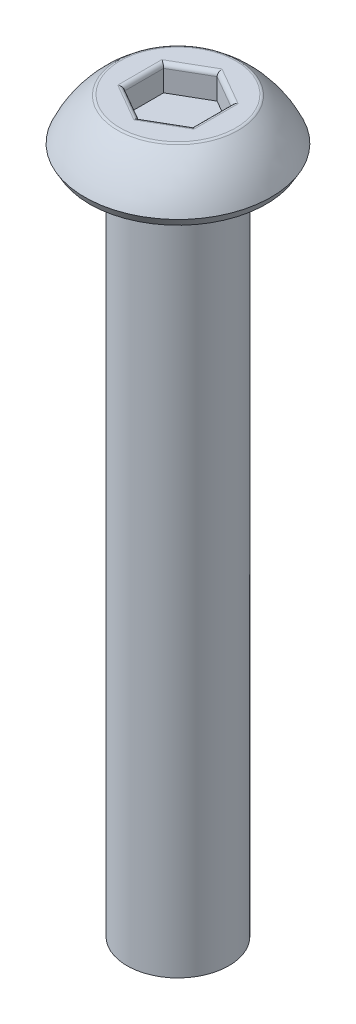
ISO-10303-21;
HEADER;
FILE_DESCRIPTION(('STEP AP214'),'2;1');
FILE_NAME('part.step','',(''),(''),'','','');
FILE_SCHEMA(('AUTOMOTIVE_DESIGN { 1 0 10303 214 1 1 1 1 }'));
ENDSEC;
DATA;
#1=APPLICATION_CONTEXT('core data for automotive mechanical design processes');
#2=APPLICATION_PROTOCOL_DEFINITION('international standard','automotive_design',2000,#1);
#3=PRODUCT_CONTEXT('',#1,'mechanical');
#4=PRODUCT('Part','Part','',(#3));
#5=PRODUCT_RELATED_PRODUCT_CATEGORY('part','',(#4));
#6=PRODUCT_DEFINITION_FORMATION('','',#4);
#7=PRODUCT_DEFINITION_CONTEXT('part definition',#1,'design');
#8=PRODUCT_DEFINITION('design','',#6,#7);
#9=PRODUCT_DEFINITION_SHAPE('','',#8);
#10=(LENGTH_UNIT() NAMED_UNIT(*) SI_UNIT(.MILLI.,.METRE.));
#11=(NAMED_UNIT(*) PLANE_ANGLE_UNIT() SI_UNIT($,.RADIAN.));
#12=(NAMED_UNIT(*) SI_UNIT($,.STERADIAN.) SOLID_ANGLE_UNIT());
#13=UNCERTAINTY_MEASURE_WITH_UNIT(LENGTH_MEASURE(1.E-05),#10,'distance_accuracy_value','');
#14=(GEOMETRIC_REPRESENTATION_CONTEXT(3) GLOBAL_UNCERTAINTY_ASSIGNED_CONTEXT((#13)) GLOBAL_UNIT_ASSIGNED_CONTEXT((#10,
#11,#12)) REPRESENTATION_CONTEXT('',''));
#15=CARTESIAN_POINT('',(0.,0.,0.));
#16=DIRECTION('',(0.,0.,1.));
#17=DIRECTION('',(1.,0.,0.));
#18=AXIS2_PLACEMENT_3D('',#15,#16,#17);
#19=CARTESIAN_POINT('',(0.,1.5,0.));
#20=DIRECTION('',(0.,-1.,0.));
#21=DIRECTION('',(0.,0.,-1.));
#22=AXIS2_PLACEMENT_3D('',#19,#20,#21);
#23=PLANE('',#22);
#24=CARTESIAN_POINT('',(0.,1.5,0.));
#25=DIRECTION('',(0.,-1.,0.));
#26=DIRECTION('',(0.,0.,-1.));
#27=AXIS2_PLACEMENT_3D('',#24,#25,#26);
#28=CIRCLE('',#27,1.70906948191647);
#29=CARTESIAN_POINT('',(0.,1.5,-1.70906948191647));
#30=VERTEX_POINT('',#29);
#31=EDGE_CURVE('E178',#30,#30,#28,.F.);
#32=ORIENTED_EDGE('',*,*,#31,.T.);
#33=EDGE_LOOP('',(#32));
#34=FACE_BOUND('',#33,.T.);
#35=DIRECTION('',(0.866025403784439,0.,-0.5));
#36=VECTOR('',#35,1.);
#37=CARTESIAN_POINT('',(0.5625,1.5,0.974278579257493));
#38=LINE('',#37,#36);
#39=CARTESIAN_POINT('',(1.125,1.5,0.649519052838329));
#40=VERTEX_POINT('',#39);
#41=CARTESIAN_POINT('',(0.,1.5,1.29903810567666));
#42=VERTEX_POINT('',#41);
#43=EDGE_CURVE('E173',#40,#42,#38,.F.);
#44=ORIENTED_EDGE('',*,*,#43,.T.);
#45=DIRECTION('',(0.866025403784439,0.,0.5));
#46=VECTOR('',#45,1.);
#47=CARTESIAN_POINT('',(-0.5625,1.5,0.974278579257493));
#48=LINE('',#47,#46);
#49=CARTESIAN_POINT('',(-1.125,1.5,0.649519052838329));
#50=VERTEX_POINT('',#49);
#51=EDGE_CURVE('E175',#42,#50,#48,.F.);
#52=ORIENTED_EDGE('',*,*,#51,.T.);
#53=DIRECTION('',(0.,0.,1.));
#54=VECTOR('',#53,1.);
#55=CARTESIAN_POINT('',(-1.125,1.5,0.));
#56=LINE('',#55,#54);
#57=CARTESIAN_POINT('',(-1.125,1.5,-0.649519052838329));
#58=VERTEX_POINT('',#57);
#59=EDGE_CURVE('E165',#50,#58,#56,.F.);
#60=ORIENTED_EDGE('',*,*,#59,.T.);
#61=DIRECTION('',(-0.866025403784439,0.,0.5));
#62=VECTOR('',#61,1.);
#63=CARTESIAN_POINT('',(-0.5625,1.5,-0.974278579257493));
#64=LINE('',#63,#62);
#65=CARTESIAN_POINT('',(0.,1.5,-1.29903810567666));
#66=VERTEX_POINT('',#65);
#67=EDGE_CURVE('E167',#58,#66,#64,.F.);
#68=ORIENTED_EDGE('',*,*,#67,.T.);
#69=DIRECTION('',(-0.866025403784439,0.,-0.5));
#70=VECTOR('',#69,1.);
#71=CARTESIAN_POINT('',(0.5625,1.5,-0.974278579257494));
#72=LINE('',#71,#70);
#73=CARTESIAN_POINT('',(1.125,1.5,-0.64951905283833));
#74=VERTEX_POINT('',#73);
#75=EDGE_CURVE('E169',#66,#74,#72,.F.);
#76=ORIENTED_EDGE('',*,*,#75,.T.);
#77=DIRECTION('',(0.,0.,-1.));
#78=VECTOR('',#77,1.);
#79=CARTESIAN_POINT('',(1.125,1.5,0.));
#80=LINE('',#79,#78);
#81=EDGE_CURVE('E171',#74,#40,#80,.F.);
#82=ORIENTED_EDGE('',*,*,#81,.T.);
#83=EDGE_LOOP('',(#44,#52,#60,#68,#76,#82));
#84=FACE_BOUND('',#83,.T.);
#85=ADVANCED_FACE('F36',(#34,#84),#23,.F.);
#86=CARTESIAN_POINT('',(0.,-0.931154789034212,0.));
#87=DIRECTION('',(0.,-1.,0.));
#88=DIRECTION('',(0.,0.,-1.));
#89=AXIS2_PLACEMENT_3D('',#86,#87,#88);
#90=DEGENERATE_TOROIDAL_SURFACE('',#89,0.00769348629276519,3.,.F.);
#91=CARTESIAN_POINT('',(0.,1.47526759952323,0.));
#92=DIRECTION('',(0.,-1.,0.));
#93=DIRECTION('',(0.,0.,-1.));
#94=AXIS2_PLACEMENT_3D('',#91,#92,#93);
#95=CIRCLE('',#94,1.78371135009948);
#96=CARTESIAN_POINT('',(0.,1.47526759952323,-1.78371135009948));
#97=VERTEX_POINT('',#96);
#98=EDGE_CURVE('E162',#97,#97,#95,.T.);
#99=ORIENTED_EDGE('',*,*,#98,.T.);
#100=EDGE_LOOP('',(#99));
#101=FACE_BOUND('',#100,.T.);
#102=CARTESIAN_POINT('',(0.,0.25,0.));
#103=DIRECTION('',(0.,-1.,0.));
#104=DIRECTION('',(0.,0.,-1.));
#105=AXIS2_PLACEMENT_3D('',#102,#103,#104);
#106=CIRCLE('',#105,2.75);
#107=CARTESIAN_POINT('',(0.,0.25,-2.75));
#108=VERTEX_POINT('',#107);
#109=EDGE_CURVE('E159',#108,#108,#106,.T.);
#110=ORIENTED_EDGE('',*,*,#109,.F.);
#111=EDGE_LOOP('',(#110));
#112=FACE_BOUND('',#111,.T.);
#113=ADVANCED_FACE('F245',(#101,#112),#90,.F.);
#114=CARTESIAN_POINT('',(0.,0.25,0.));
#115=DIRECTION('',(0.,1.,0.));
#116=DIRECTION('',(0.,0.,1.));
#117=AXIS2_PLACEMENT_3D('',#114,#115,#116);
#118=CONICAL_SURFACE('',#117,2.75,0.523598775598296);
#119=CARTESIAN_POINT('',(0.,0.,0.));
#120=DIRECTION('',(0.,-1.,0.));
#121=DIRECTION('',(0.,0.,-1.));
#122=AXIS2_PLACEMENT_3D('',#119,#120,#121);
#123=CIRCLE('',#122,2.60566243270259);
#124=CARTESIAN_POINT('',(0.,0.,-2.60566243270259));
#125=VERTEX_POINT('',#124);
#126=EDGE_CURVE('E156',#125,#125,#123,.T.);
#127=ORIENTED_EDGE('',*,*,#126,.F.);
#128=EDGE_LOOP('',(#127));
#129=FACE_BOUND('',#128,.T.);
#130=ORIENTED_EDGE('',*,*,#109,.T.);
#131=EDGE_LOOP('',(#130));
#132=FACE_BOUND('',#131,.T.);
#133=ADVANCED_FACE('F251',(#129,#132),#118,.T.);
#134=CARTESIAN_POINT('',(0.,0.,2.60566243270259));
#135=DIRECTION('',(0.,1.,0.));
#136=DIRECTION('',(0.,0.,1.));
#137=AXIS2_PLACEMENT_3D('',#134,#135,#136);
#138=PLANE('',#137);
#139=CARTESIAN_POINT('',(0.,0.,0.));
#140=DIRECTION('',(0.,-1.,0.));
#141=DIRECTION('',(0.,0.,-1.));
#142=AXIS2_PLACEMENT_3D('',#139,#140,#141);
#143=CIRCLE('',#142,1.5);
#144=CARTESIAN_POINT('',(0.,0.,-1.5));
#145=VERTEX_POINT('',#144);
#146=EDGE_CURVE('E153',#145,#145,#143,.T.);
#147=ORIENTED_EDGE('',*,*,#146,.F.);
#148=EDGE_LOOP('',(#147));
#149=FACE_BOUND('',#148,.T.);
#150=ORIENTED_EDGE('',*,*,#126,.T.);
#151=EDGE_LOOP('',(#150));
#152=FACE_BOUND('',#151,.T.);
#153=ADVANCED_FACE('F270',(#149,#152),#138,.F.);
#154=CARTESIAN_POINT('',(0.,-20.,0.));
#155=DIRECTION('',(0.,-1.,0.));
#156=DIRECTION('',(0.,0.,-1.));
#157=AXIS2_PLACEMENT_3D('',#154,#155,#156);
#158=CYLINDRICAL_SURFACE('',#157,1.5);
#159=CARTESIAN_POINT('',(0.,-20.,0.));
#160=DIRECTION('',(0.,-1.,0.));
#161=DIRECTION('',(0.,0.,-1.));
#162=AXIS2_PLACEMENT_3D('',#159,#160,#161);
#163=CIRCLE('',#162,1.5);
#164=CARTESIAN_POINT('',(0.,-20.,-1.5));
#165=VERTEX_POINT('',#164);
#166=EDGE_CURVE('E140',#165,#165,#163,.T.);
#167=ORIENTED_EDGE('',*,*,#166,.F.);
#168=EDGE_LOOP('',(#167));
#169=FACE_BOUND('',#168,.T.);
#170=ORIENTED_EDGE('',*,*,#146,.T.);
#171=EDGE_LOOP('',(#170));
#172=FACE_BOUND('',#171,.T.);
#173=ADVANCED_FACE('F275',(#169,#172),#158,.T.);
#174=CARTESIAN_POINT('',(0.,-20.,1.5));
#175=DIRECTION('',(0.,1.,0.));
#176=DIRECTION('',(0.,0.,1.));
#177=AXIS2_PLACEMENT_3D('',#174,#175,#176);
#178=PLANE('',#177);
#179=ORIENTED_EDGE('',*,*,#166,.T.);
#180=EDGE_LOOP('',(#179));
#181=FACE_BOUND('',#180,.T.);
#182=ADVANCED_FACE('F282',(#181),#178,.F.);
#183=CARTESIAN_POINT('',(0.999999999999999,0.75,-0.577350269189626));
#184=DIRECTION('',(0.5,0.,-0.866025403784439));
#185=DIRECTION('',(-0.866025403784439,0.,-0.5));
#186=AXIS2_PLACEMENT_3D('',#183,#184,#185);
#187=PLANE('',#186);
#188=DIRECTION('',(0.,1.,0.));
#189=VECTOR('',#188,1.);
#190=CARTESIAN_POINT('',(0.999999999999999,0.75,-0.577350269189626));
#191=LINE('',#190,#189);
#192=CARTESIAN_POINT('',(0.999999999999999,0.75,-0.577350269189626));
#193=VERTEX_POINT('',#192);
#194=CARTESIAN_POINT('',(0.999999999999999,1.375,-0.577350269189626));
#195=VERTEX_POINT('',#194);
#196=EDGE_CURVE('E138',#193,#195,#191,.T.);
#197=ORIENTED_EDGE('',*,*,#196,.T.);
#198=DIRECTION('',(-0.866025403784439,0.,-0.5));
#199=VECTOR('',#198,1.);
#200=CARTESIAN_POINT('',(0.999999999999999,1.375,-0.577350269189626));
#201=LINE('',#200,#199);
#202=CARTESIAN_POINT('',(0.,1.375,-1.15470053837925));
#203=VERTEX_POINT('',#202);
#204=EDGE_CURVE('E60',#195,#203,#201,.T.);
#205=ORIENTED_EDGE('',*,*,#204,.T.);
#206=DIRECTION('',(0.,1.,0.));
#207=VECTOR('',#206,1.);
#208=CARTESIAN_POINT('',(0.,0.75,-1.15470053837925));
#209=LINE('',#208,#207);
#210=CARTESIAN_POINT('',(0.,0.75,-1.15470053837925));
#211=VERTEX_POINT('',#210);
#212=EDGE_CURVE('E106',#211,#203,#209,.T.);
#213=ORIENTED_EDGE('',*,*,#212,.F.);
#214=DIRECTION('',(-0.866025403784439,0.,-0.5));
#215=VECTOR('',#214,1.);
#216=CARTESIAN_POINT('',(0.999999999999999,0.75,-0.577350269189626));
#217=LINE('',#216,#215);
#218=EDGE_CURVE('E110',#193,#211,#217,.T.);
#219=ORIENTED_EDGE('',*,*,#218,.F.);
#220=EDGE_LOOP('',(#197,#205,#213,#219));
#221=FACE_BOUND('',#220,.T.);
#222=ADVANCED_FACE('F108',(#221),#187,.F.);
#223=CARTESIAN_POINT('',(1.,0.75,0.577350269189626));
#224=DIRECTION('',(1.,0.,0.));
#225=DIRECTION('',(0.,0.,-1.));
#226=AXIS2_PLACEMENT_3D('',#223,#224,#225);
#227=PLANE('',#226);
#228=DIRECTION('',(0.,1.,0.));
#229=VECTOR('',#228,1.);
#230=CARTESIAN_POINT('',(1.,0.75,0.577350269189626));
#231=LINE('',#230,#229);
#232=CARTESIAN_POINT('',(1.,0.75,0.577350269189626));
#233=VERTEX_POINT('',#232);
#234=CARTESIAN_POINT('',(1.,1.375,0.577350269189626));
#235=VERTEX_POINT('',#234);
#236=EDGE_CURVE('E141',#233,#235,#231,.T.);
#237=ORIENTED_EDGE('',*,*,#236,.T.);
#238=DIRECTION('',(0.,0.,-1.));
#239=VECTOR('',#238,1.);
#240=CARTESIAN_POINT('',(1.,1.375,0.577350269189626));
#241=LINE('',#240,#239);
#242=EDGE_CURVE('E186',#235,#195,#241,.T.);
#243=ORIENTED_EDGE('',*,*,#242,.T.);
#244=ORIENTED_EDGE('',*,*,#196,.F.);
#245=DIRECTION('',(0.,0.,-1.));
#246=VECTOR('',#245,1.);
#247=CARTESIAN_POINT('',(1.,0.75,0.577350269189626));
#248=LINE('',#247,#246);
#249=EDGE_CURVE('E114',#233,#193,#248,.T.);
#250=ORIENTED_EDGE('',*,*,#249,.F.);
#251=EDGE_LOOP('',(#237,#243,#244,#250));
#252=FACE_BOUND('',#251,.T.);
#253=ADVANCED_FACE('F226',(#252),#227,.F.);
#254=CARTESIAN_POINT('',(0.,0.75,1.15470053837925));
#255=DIRECTION('',(0.5,0.,0.866025403784439));
#256=DIRECTION('',(0.866025403784439,0.,-0.5));
#257=AXIS2_PLACEMENT_3D('',#254,#255,#256);
#258=PLANE('',#257);
#259=DIRECTION('',(0.,1.,0.));
#260=VECTOR('',#259,1.);
#261=CARTESIAN_POINT('',(0.,0.75,1.15470053837925));
#262=LINE('',#261,#260);
#263=CARTESIAN_POINT('',(0.,0.75,1.15470053837925));
#264=VERTEX_POINT('',#263);
#265=CARTESIAN_POINT('',(0.,1.375,1.15470053837925));
#266=VERTEX_POINT('',#265);
#267=EDGE_CURVE('E144',#264,#266,#262,.T.);
#268=ORIENTED_EDGE('',*,*,#267,.T.);
#269=DIRECTION('',(0.866025403784439,0.,-0.5));
#270=VECTOR('',#269,1.);
#271=CARTESIAN_POINT('',(0.,1.375,1.15470053837925));
#272=LINE('',#271,#270);
#273=EDGE_CURVE('E184',#266,#235,#272,.T.);
#274=ORIENTED_EDGE('',*,*,#273,.T.);
#275=ORIENTED_EDGE('',*,*,#236,.F.);
#276=DIRECTION('',(0.866025403784439,0.,-0.5));
#277=VECTOR('',#276,1.);
#278=CARTESIAN_POINT('',(0.,0.75,1.15470053837925));
#279=LINE('',#278,#277);
#280=EDGE_CURVE('E135',#264,#233,#279,.T.);
#281=ORIENTED_EDGE('',*,*,#280,.F.);
#282=EDGE_LOOP('',(#268,#274,#275,#281));
#283=FACE_BOUND('',#282,.T.);
#284=ADVANCED_FACE('F227',(#283),#258,.F.);
#285=CARTESIAN_POINT('',(-0.999999999999999,0.75,0.577350269189626));
#286=DIRECTION('',(-0.5,0.,0.866025403784439));
#287=DIRECTION('',(0.866025403784439,0.,0.5));
#288=AXIS2_PLACEMENT_3D('',#285,#286,#287);
#289=PLANE('',#288);
#290=DIRECTION('',(0.,1.,0.));
#291=VECTOR('',#290,1.);
#292=CARTESIAN_POINT('',(-0.999999999999999,0.75,0.577350269189626));
#293=LINE('',#292,#291);
#294=CARTESIAN_POINT('',(-0.999999999999999,0.75,0.577350269189626));
#295=VERTEX_POINT('',#294);
#296=CARTESIAN_POINT('',(-0.999999999999999,1.375,0.577350269189626));
#297=VERTEX_POINT('',#296);
#298=EDGE_CURVE('E147',#295,#297,#293,.T.);
#299=ORIENTED_EDGE('',*,*,#298,.T.);
#300=DIRECTION('',(0.866025403784439,0.,0.5));
#301=VECTOR('',#300,1.);
#302=CARTESIAN_POINT('',(-0.999999999999999,1.375,0.577350269189626));
#303=LINE('',#302,#301);
#304=EDGE_CURVE('E181',#297,#266,#303,.T.);
#305=ORIENTED_EDGE('',*,*,#304,.T.);
#306=ORIENTED_EDGE('',*,*,#267,.F.);
#307=DIRECTION('',(0.866025403784439,0.,0.5));
#308=VECTOR('',#307,1.);
#309=CARTESIAN_POINT('',(-0.999999999999999,0.75,0.577350269189626));
#310=LINE('',#309,#308);
#311=EDGE_CURVE('E132',#295,#264,#310,.T.);
#312=ORIENTED_EDGE('',*,*,#311,.F.);
#313=EDGE_LOOP('',(#299,#305,#306,#312));
#314=FACE_BOUND('',#313,.T.);
#315=ADVANCED_FACE('F222',(#314),#289,.F.);
#316=CARTESIAN_POINT('',(-1.,0.75,-0.577350269189626));
#317=DIRECTION('',(-1.,0.,0.));
#318=DIRECTION('',(0.,0.,1.));
#319=AXIS2_PLACEMENT_3D('',#316,#317,#318);
#320=PLANE('',#319);
#321=DIRECTION('',(0.,1.,0.));
#322=VECTOR('',#321,1.);
#323=CARTESIAN_POINT('',(-1.,0.75,-0.577350269189626));
#324=LINE('',#323,#322);
#325=CARTESIAN_POINT('',(-1.,0.75,-0.577350269189626));
#326=VERTEX_POINT('',#325);
#327=CARTESIAN_POINT('',(-1.,1.375,-0.577350269189626));
#328=VERTEX_POINT('',#327);
#329=EDGE_CURVE('E113',#326,#328,#324,.T.);
#330=ORIENTED_EDGE('',*,*,#329,.T.);
#331=DIRECTION('',(0.,0.,1.));
#332=VECTOR('',#331,1.);
#333=CARTESIAN_POINT('',(-1.,1.375,-0.577350269189626));
#334=LINE('',#333,#332);
#335=EDGE_CURVE('E11',#328,#297,#334,.T.);
#336=ORIENTED_EDGE('',*,*,#335,.T.);
#337=ORIENTED_EDGE('',*,*,#298,.F.);
#338=DIRECTION('',(0.,0.,1.));
#339=VECTOR('',#338,1.);
#340=CARTESIAN_POINT('',(-1.,0.75,-0.577350269189626));
#341=LINE('',#340,#339);
#342=EDGE_CURVE('E122',#326,#295,#341,.T.);
#343=ORIENTED_EDGE('',*,*,#342,.F.);
#344=EDGE_LOOP('',(#330,#336,#337,#343));
#345=FACE_BOUND('',#344,.T.);
#346=ADVANCED_FACE('F219',(#345),#320,.F.);
#347=CARTESIAN_POINT('',(0.,0.75,-1.15470053837925));
#348=DIRECTION('',(-0.5,0.,-0.866025403784438));
#349=DIRECTION('',(-0.866025403784439,0.,0.5));
#350=AXIS2_PLACEMENT_3D('',#347,#348,#349);
#351=PLANE('',#350);
#352=ORIENTED_EDGE('',*,*,#212,.T.);
#353=DIRECTION('',(-0.866025403784439,0.,0.5));
#354=VECTOR('',#353,1.);
#355=CARTESIAN_POINT('',(0.,1.375,-1.15470053837925));
#356=LINE('',#355,#354);
#357=EDGE_CURVE('E45',#203,#328,#356,.T.);
#358=ORIENTED_EDGE('',*,*,#357,.T.);
#359=ORIENTED_EDGE('',*,*,#329,.F.);
#360=DIRECTION('',(-0.866025403784439,0.,0.5));
#361=VECTOR('',#360,1.);
#362=CARTESIAN_POINT('',(0.,0.75,-1.15470053837925));
#363=LINE('',#362,#361);
#364=EDGE_CURVE('E117',#211,#326,#363,.T.);
#365=ORIENTED_EDGE('',*,*,#364,.F.);
#366=EDGE_LOOP('',(#352,#358,#359,#365));
#367=FACE_BOUND('',#366,.T.);
#368=ADVANCED_FACE('F118',(#367),#351,.F.);
#369=CARTESIAN_POINT('',(0.,0.75,0.));
#370=DIRECTION('',(0.,1.,0.));
#371=DIRECTION('',(0.,0.,1.));
#372=AXIS2_PLACEMENT_3D('',#369,#370,#371);
#373=PLANE('',#372);
#374=ORIENTED_EDGE('',*,*,#218,.T.);
#375=ORIENTED_EDGE('',*,*,#364,.T.);
#376=ORIENTED_EDGE('',*,*,#342,.T.);
#377=ORIENTED_EDGE('',*,*,#311,.T.);
#378=ORIENTED_EDGE('',*,*,#280,.T.);
#379=ORIENTED_EDGE('',*,*,#249,.T.);
#380=EDGE_LOOP('',(#374,#375,#376,#377,#378,#379));
#381=FACE_BOUND('',#380,.T.);
#382=ADVANCED_FACE('F124',(#381),#373,.T.);
#383=CARTESIAN_POINT('',(0.,1.375,0.));
#384=DIRECTION('',(0.,-1.,0.));
#385=DIRECTION('',(0.,0.,-1.));
#386=AXIS2_PLACEMENT_3D('',#383,#384,#385);
#387=TOROIDAL_SURFACE('',#386,1.70906948191647,0.125);
#388=ORIENTED_EDGE('',*,*,#31,.F.);
#389=EDGE_LOOP('',(#388));
#390=FACE_BOUND('',#389,.T.);
#391=ORIENTED_EDGE('',*,*,#98,.F.);
#392=EDGE_LOOP('',(#391));
#393=FACE_BOUND('',#392,.T.);
#394=ADVANCED_FACE('F255',(#390,#393),#387,.T.);
#395=CARTESIAN_POINT('',(1.0625,1.375,-0.685603444662681));
#396=DIRECTION('',(-0.866025403784439,0.,-0.5));
#397=DIRECTION('',(-0.5,0.,0.866025403784439));
#398=AXIS2_PLACEMENT_3D('',#395,#396,#397);
#399=CYLINDRICAL_SURFACE('',#398,0.125);
#400=CARTESIAN_POINT('',(1.125,1.375,-0.64951905283833));
#401=DIRECTION('',(-0.5,0.,-0.866025403784438));
#402=DIRECTION('',(0.866025403784439,0.,-0.5));
#403=AXIS2_PLACEMENT_3D('',#400,#401,#402);
#404=ELLIPSE('',#403,0.144337567297406,0.125);
#405=EDGE_CURVE('E129',#74,#195,#404,.F.);
#406=ORIENTED_EDGE('',*,*,#405,.F.);
#407=ORIENTED_EDGE('',*,*,#75,.F.);
#408=CARTESIAN_POINT('',(0.,1.375,-1.29903810567666));
#409=DIRECTION('',(-1.,0.,0.));
#410=DIRECTION('',(0.,0.,-1.));
#411=AXIS2_PLACEMENT_3D('',#408,#409,#410);
#412=ELLIPSE('',#411,0.144337567297406,0.125);
#413=EDGE_CURVE('E40',#203,#66,#412,.T.);
#414=ORIENTED_EDGE('',*,*,#413,.F.);
#415=ORIENTED_EDGE('',*,*,#204,.F.);
#416=EDGE_LOOP('',(#406,#407,#414,#415));
#417=FACE_BOUND('',#416,.T.);
#418=ADVANCED_FACE('F38',(#417),#399,.T.);
#419=CARTESIAN_POINT('',(-0.0625000000000002,1.375,-1.26295371385231));
#420=DIRECTION('',(-0.866025403784439,0.,0.5));
#421=DIRECTION('',(0.5,0.,0.866025403784439));
#422=AXIS2_PLACEMENT_3D('',#419,#420,#421);
#423=CYLINDRICAL_SURFACE('',#422,0.125);
#424=ORIENTED_EDGE('',*,*,#413,.T.);
#425=ORIENTED_EDGE('',*,*,#67,.F.);
#426=CARTESIAN_POINT('',(-1.125,1.375,-0.649519052838329));
#427=DIRECTION('',(-0.5,0.,0.866025403784439));
#428=DIRECTION('',(-0.866025403784439,0.,-0.5));
#429=AXIS2_PLACEMENT_3D('',#426,#427,#428);
#430=ELLIPSE('',#429,0.144337567297406,0.125);
#431=EDGE_CURVE('E197',#328,#58,#430,.T.);
#432=ORIENTED_EDGE('',*,*,#431,.F.);
#433=ORIENTED_EDGE('',*,*,#357,.F.);
#434=EDGE_LOOP('',(#424,#425,#432,#433));
#435=FACE_BOUND('',#434,.T.);
#436=ADVANCED_FACE('F211',(#435),#423,.T.);
#437=CARTESIAN_POINT('',(1.125,1.375,0.577350269189626));
#438=DIRECTION('',(0.,0.,-1.));
#439=DIRECTION('',(-1.,0.,0.));
#440=AXIS2_PLACEMENT_3D('',#437,#438,#439);
#441=CYLINDRICAL_SURFACE('',#440,0.125);
#442=ORIENTED_EDGE('',*,*,#405,.T.);
#443=ORIENTED_EDGE('',*,*,#242,.F.);
#444=CARTESIAN_POINT('',(1.125,1.375,0.649519052838329));
#445=DIRECTION('',(0.5,0.,-0.866025403784439));
#446=DIRECTION('',(0.866025403784439,0.,0.5));
#447=AXIS2_PLACEMENT_3D('',#444,#445,#446);
#448=ELLIPSE('',#447,0.144337567297406,0.125);
#449=EDGE_CURVE('E194',#40,#235,#448,.F.);
#450=ORIENTED_EDGE('',*,*,#449,.F.);
#451=ORIENTED_EDGE('',*,*,#81,.F.);
#452=EDGE_LOOP('',(#442,#443,#450,#451));
#453=FACE_BOUND('',#452,.T.);
#454=ADVANCED_FACE('F204',(#453),#441,.T.);
#455=CARTESIAN_POINT('',(-1.125,1.375,-0.577350269189626));
#456=DIRECTION('',(0.,0.,1.));
#457=DIRECTION('',(1.,0.,0.));
#458=AXIS2_PLACEMENT_3D('',#455,#456,#457);
#459=CYLINDRICAL_SURFACE('',#458,0.125);
#460=ORIENTED_EDGE('',*,*,#431,.T.);
#461=ORIENTED_EDGE('',*,*,#59,.F.);
#462=CARTESIAN_POINT('',(-1.125,1.375,0.649519052838329));
#463=DIRECTION('',(0.5,0.,0.866025403784438));
#464=DIRECTION('',(0.866025403784439,0.,-0.5));
#465=AXIS2_PLACEMENT_3D('',#462,#463,#464);
#466=ELLIPSE('',#465,0.144337567297406,0.125);
#467=EDGE_CURVE('E192',#297,#50,#466,.T.);
#468=ORIENTED_EDGE('',*,*,#467,.F.);
#469=ORIENTED_EDGE('',*,*,#335,.F.);
#470=EDGE_LOOP('',(#460,#461,#468,#469));
#471=FACE_BOUND('',#470,.T.);
#472=ADVANCED_FACE('F216',(#471),#459,.T.);
#473=CARTESIAN_POINT('',(0.0625000000000004,1.375,1.26295371385231));
#474=DIRECTION('',(0.866025403784439,0.,-0.5));
#475=DIRECTION('',(-0.5,0.,-0.866025403784439));
#476=AXIS2_PLACEMENT_3D('',#473,#474,#475);
#477=CYLINDRICAL_SURFACE('',#476,0.125);
#478=ORIENTED_EDGE('',*,*,#449,.T.);
#479=ORIENTED_EDGE('',*,*,#273,.F.);
#480=CARTESIAN_POINT('',(0.,1.375,1.29903810567666));
#481=DIRECTION('',(1.,0.,0.));
#482=DIRECTION('',(0.,0.,1.));
#483=AXIS2_PLACEMENT_3D('',#480,#481,#482);
#484=ELLIPSE('',#483,0.144337567297406,0.125);
#485=EDGE_CURVE('E190',#42,#266,#484,.F.);
#486=ORIENTED_EDGE('',*,*,#485,.F.);
#487=ORIENTED_EDGE('',*,*,#43,.F.);
#488=EDGE_LOOP('',(#478,#479,#486,#487));
#489=FACE_BOUND('',#488,.T.);
#490=ADVANCED_FACE('F231',(#489),#477,.T.);
#491=CARTESIAN_POINT('',(-1.0625,1.375,0.685603444662681));
#492=DIRECTION('',(0.866025403784439,0.,0.5));
#493=DIRECTION('',(0.5,0.,-0.866025403784439));
#494=AXIS2_PLACEMENT_3D('',#491,#492,#493);
#495=CYLINDRICAL_SURFACE('',#494,0.125);
#496=ORIENTED_EDGE('',*,*,#467,.T.);
#497=ORIENTED_EDGE('',*,*,#51,.F.);
#498=ORIENTED_EDGE('',*,*,#485,.T.);
#499=ORIENTED_EDGE('',*,*,#304,.F.);
#500=EDGE_LOOP('',(#496,#497,#498,#499));
#501=FACE_BOUND('',#500,.T.);
#502=ADVANCED_FACE('F236',(#501),#495,.T.);
#503=CLOSED_SHELL('',(#85,#113,#133,#153,#173,#182,#222,#253,#284,#315,#346,#368,#382,#394,#418,
#436,#454,#472,#490,#502));
#504=MANIFOLD_SOLID_BREP('B2',#503);
#505=ADVANCED_BREP_SHAPE_REPRESENTATION('',(#18,#504),#14);
#506=SHAPE_DEFINITION_REPRESENTATION(#9,#505);
ENDSEC;
END-ISO-10303-21;
